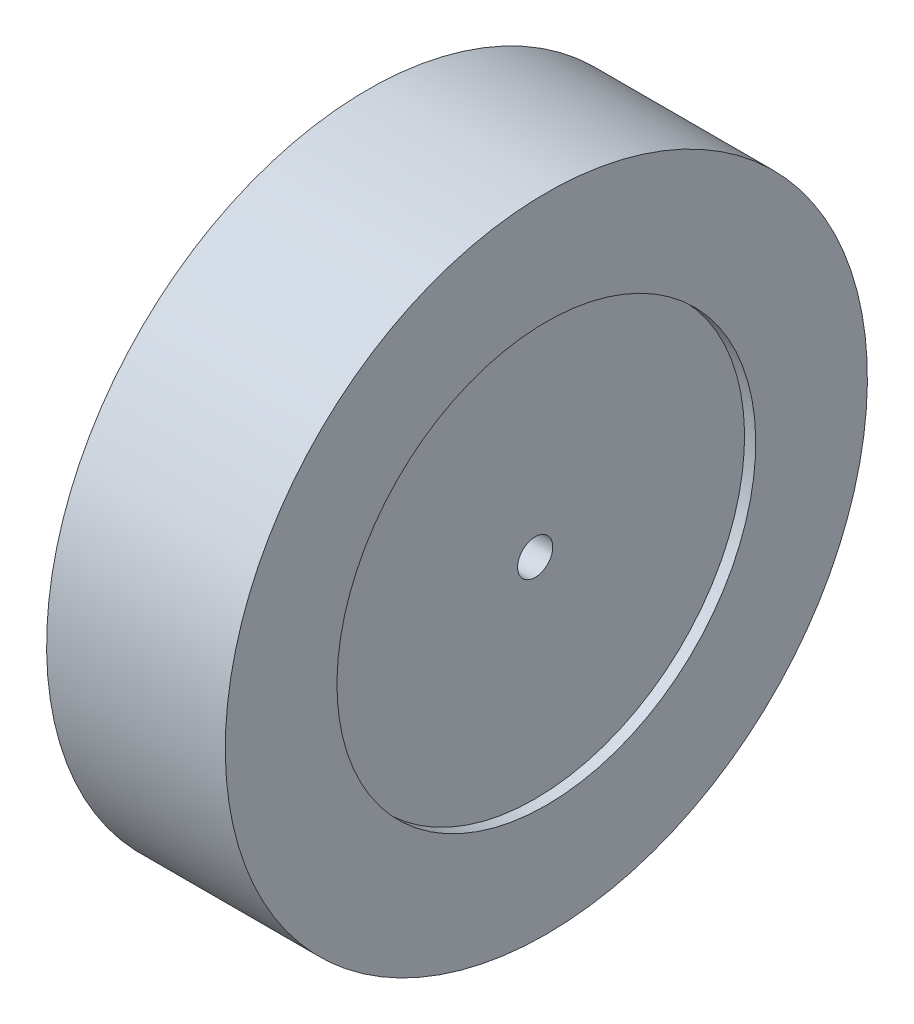
ISO-10303-21;
HEADER;
FILE_DESCRIPTION(('STEP AP214'),'2;1');
FILE_NAME('part.step','',(''),(''),'','','');
FILE_SCHEMA(('AUTOMOTIVE_DESIGN { 1 0 10303 214 1 1 1 1 }'));
ENDSEC;
DATA;
#1=APPLICATION_CONTEXT('core data for automotive mechanical design processes');
#2=APPLICATION_PROTOCOL_DEFINITION('international standard','automotive_design',2000,#1);
#3=PRODUCT_CONTEXT('',#1,'mechanical');
#4=PRODUCT('Part','Part','',(#3));
#5=PRODUCT_RELATED_PRODUCT_CATEGORY('part','',(#4));
#6=PRODUCT_DEFINITION_FORMATION('','',#4);
#7=PRODUCT_DEFINITION_CONTEXT('part definition',#1,'design');
#8=PRODUCT_DEFINITION('design','',#6,#7);
#9=PRODUCT_DEFINITION_SHAPE('','',#8);
#10=(LENGTH_UNIT() NAMED_UNIT(*) SI_UNIT(.MILLI.,.METRE.));
#11=(NAMED_UNIT(*) PLANE_ANGLE_UNIT() SI_UNIT($,.RADIAN.));
#12=(NAMED_UNIT(*) SI_UNIT($,.STERADIAN.) SOLID_ANGLE_UNIT());
#13=UNCERTAINTY_MEASURE_WITH_UNIT(LENGTH_MEASURE(1.E-05),#10,'distance_accuracy_value','');
#14=(GEOMETRIC_REPRESENTATION_CONTEXT(3) GLOBAL_UNCERTAINTY_ASSIGNED_CONTEXT((#13)) GLOBAL_UNIT_ASSIGNED_CONTEXT((#10,
#11,#12)) REPRESENTATION_CONTEXT('',''));
#15=CARTESIAN_POINT('',(0.,0.,0.));
#16=DIRECTION('',(0.,0.,1.));
#17=DIRECTION('',(1.,0.,0.));
#18=AXIS2_PLACEMENT_3D('',#15,#16,#17);
#19=CARTESIAN_POINT('',(-8.89,0.,0.));
#20=DIRECTION('',(-1.,0.,0.));
#21=DIRECTION('',(0.,-1.,0.));
#22=AXIS2_PLACEMENT_3D('',#19,#20,#21);
#23=CYLINDRICAL_SURFACE('',#22,36.5125);
#24=CARTESIAN_POINT('',(-10.16,0.,0.));
#25=DIRECTION('',(-1.,0.,0.));
#26=DIRECTION('',(0.,-1.,0.));
#27=AXIS2_PLACEMENT_3D('',#24,#25,#26);
#28=CIRCLE('',#27,36.5125);
#29=CARTESIAN_POINT('',(-10.16,-36.5125,0.));
#30=VERTEX_POINT('',#29);
#31=EDGE_CURVE('E12',#30,#30,#28,.T.);
#32=ORIENTED_EDGE('',*,*,#31,.F.);
#33=EDGE_LOOP('',(#32));
#34=FACE_BOUND('',#33,.T.);
#35=CARTESIAN_POINT('',(10.16,0.,0.));
#36=DIRECTION('',(-1.,0.,0.));
#37=DIRECTION('',(0.,-1.,0.));
#38=AXIS2_PLACEMENT_3D('',#35,#36,#37);
#39=CIRCLE('',#38,36.5125);
#40=CARTESIAN_POINT('',(10.16,-36.5125,0.));
#41=VERTEX_POINT('',#40);
#42=EDGE_CURVE('E73',#41,#41,#39,.T.);
#43=ORIENTED_EDGE('',*,*,#42,.T.);
#44=EDGE_LOOP('',(#43));
#45=FACE_BOUND('',#44,.T.);
#46=ADVANCED_FACE('F45',(#34,#45),#23,.T.);
#47=CARTESIAN_POINT('',(-10.16,0.,0.));
#48=DIRECTION('',(-1.,0.,0.));
#49=DIRECTION('',(0.,-1.,0.));
#50=AXIS2_PLACEMENT_3D('',#47,#48,#49);
#51=PLANE('',#50);
#52=ORIENTED_EDGE('',*,*,#31,.T.);
#53=EDGE_LOOP('',(#52));
#54=FACE_BOUND('',#53,.T.);
#55=CARTESIAN_POINT('',(-10.16,0.,0.));
#56=DIRECTION('',(-1.,0.,0.));
#57=DIRECTION('',(0.,-1.,0.));
#58=AXIS2_PLACEMENT_3D('',#55,#56,#57);
#59=CIRCLE('',#58,23.8125);
#60=CARTESIAN_POINT('',(-10.16,-23.8125,0.));
#61=VERTEX_POINT('',#60);
#62=EDGE_CURVE('E51',#61,#61,#59,.T.);
#63=ORIENTED_EDGE('',*,*,#62,.F.);
#64=EDGE_LOOP('',(#63));
#65=FACE_BOUND('',#64,.T.);
#66=ADVANCED_FACE('F110',(#54,#65),#51,.T.);
#67=CARTESIAN_POINT('',(-8.89,0.,0.));
#68=DIRECTION('',(-1.,0.,0.));
#69=DIRECTION('',(0.,-1.,0.));
#70=AXIS2_PLACEMENT_3D('',#67,#68,#69);
#71=CYLINDRICAL_SURFACE('',#70,23.8125);
#72=ORIENTED_EDGE('',*,*,#62,.T.);
#73=EDGE_LOOP('',(#72));
#74=FACE_BOUND('',#73,.T.);
#75=CARTESIAN_POINT('',(-8.89,0.,0.));
#76=DIRECTION('',(-1.,0.,0.));
#77=DIRECTION('',(0.,-1.,0.));
#78=AXIS2_PLACEMENT_3D('',#75,#76,#77);
#79=CIRCLE('',#78,23.8125);
#80=CARTESIAN_POINT('',(-8.89,-23.8125,0.));
#81=VERTEX_POINT('',#80);
#82=EDGE_CURVE('E55',#81,#81,#79,.T.);
#83=ORIENTED_EDGE('',*,*,#82,.F.);
#84=EDGE_LOOP('',(#83));
#85=FACE_BOUND('',#84,.T.);
#86=ADVANCED_FACE('F104',(#74,#85),#71,.F.);
#87=CARTESIAN_POINT('',(-8.89,0.,0.));
#88=DIRECTION('',(-1.,0.,0.));
#89=DIRECTION('',(0.,-1.,0.));
#90=AXIS2_PLACEMENT_3D('',#87,#88,#89);
#91=PLANE('',#90);
#92=ORIENTED_EDGE('',*,*,#82,.T.);
#93=EDGE_LOOP('',(#92));
#94=FACE_BOUND('',#93,.T.);
#95=CARTESIAN_POINT('',(-8.89,0.,0.));
#96=DIRECTION('',(-1.,0.,0.));
#97=DIRECTION('',(0.,-1.,0.));
#98=AXIS2_PLACEMENT_3D('',#95,#96,#97);
#99=CIRCLE('',#98,2.);
#100=CARTESIAN_POINT('',(-8.89,-2.,0.));
#101=VERTEX_POINT('',#100);
#102=EDGE_CURVE('E59',#101,#101,#99,.T.);
#103=ORIENTED_EDGE('',*,*,#102,.F.);
#104=EDGE_LOOP('',(#103));
#105=FACE_BOUND('',#104,.T.);
#106=ADVANCED_FACE('F99',(#94,#105),#91,.T.);
#107=CARTESIAN_POINT('',(-8.89,0.,0.));
#108=DIRECTION('',(-1.,0.,0.));
#109=DIRECTION('',(0.,-1.,0.));
#110=AXIS2_PLACEMENT_3D('',#107,#108,#109);
#111=CYLINDRICAL_SURFACE('',#110,2.);
#112=CARTESIAN_POINT('',(8.89,0.,0.));
#113=DIRECTION('',(-1.,0.,0.));
#114=DIRECTION('',(0.,-1.,0.));
#115=AXIS2_PLACEMENT_3D('',#112,#113,#114);
#116=CIRCLE('',#115,2.);
#117=CARTESIAN_POINT('',(8.89,-2.,0.));
#118=VERTEX_POINT('',#117);
#119=EDGE_CURVE('E64',#118,#118,#116,.T.);
#120=ORIENTED_EDGE('',*,*,#119,.F.);
#121=EDGE_LOOP('',(#120));
#122=FACE_BOUND('',#121,.T.);
#123=ORIENTED_EDGE('',*,*,#102,.T.);
#124=EDGE_LOOP('',(#123));
#125=FACE_BOUND('',#124,.T.);
#126=ADVANCED_FACE('F93',(#122,#125),#111,.F.);
#127=CARTESIAN_POINT('',(8.89000000000001,0.,0.));
#128=DIRECTION('',(-1.,0.,0.));
#129=DIRECTION('',(0.,-1.,0.));
#130=AXIS2_PLACEMENT_3D('',#127,#128,#129);
#131=PLANE('',#130);
#132=CARTESIAN_POINT('',(8.89000000000001,0.,0.));
#133=DIRECTION('',(-1.,0.,0.));
#134=DIRECTION('',(0.,-1.,0.));
#135=AXIS2_PLACEMENT_3D('',#132,#133,#134);
#136=CIRCLE('',#135,23.8125);
#137=CARTESIAN_POINT('',(8.89000000000001,-23.8125,0.));
#138=VERTEX_POINT('',#137);
#139=EDGE_CURVE('E67',#138,#138,#136,.T.);
#140=ORIENTED_EDGE('',*,*,#139,.F.);
#141=EDGE_LOOP('',(#140));
#142=FACE_BOUND('',#141,.T.);
#143=ORIENTED_EDGE('',*,*,#119,.T.);
#144=EDGE_LOOP('',(#143));
#145=FACE_BOUND('',#144,.T.);
#146=ADVANCED_FACE('F87',(#142,#145),#131,.F.);
#147=CARTESIAN_POINT('',(-8.89,0.,0.));
#148=DIRECTION('',(-1.,0.,0.));
#149=DIRECTION('',(0.,-1.,0.));
#150=AXIS2_PLACEMENT_3D('',#147,#148,#149);
#151=CYLINDRICAL_SURFACE('',#150,23.8125);
#152=CARTESIAN_POINT('',(10.16,0.,0.));
#153=DIRECTION('',(-1.,0.,0.));
#154=DIRECTION('',(0.,-1.,0.));
#155=AXIS2_PLACEMENT_3D('',#152,#153,#154);
#156=CIRCLE('',#155,23.8125);
#157=CARTESIAN_POINT('',(10.16,-23.8125,0.));
#158=VERTEX_POINT('',#157);
#159=EDGE_CURVE('E70',#158,#158,#156,.T.);
#160=ORIENTED_EDGE('',*,*,#159,.F.);
#161=EDGE_LOOP('',(#160));
#162=FACE_BOUND('',#161,.T.);
#163=ORIENTED_EDGE('',*,*,#139,.T.);
#164=EDGE_LOOP('',(#163));
#165=FACE_BOUND('',#164,.T.);
#166=ADVANCED_FACE('F81',(#162,#165),#151,.F.);
#167=CARTESIAN_POINT('',(10.16,0.,0.));
#168=DIRECTION('',(-1.,0.,0.));
#169=DIRECTION('',(0.,-1.,0.));
#170=AXIS2_PLACEMENT_3D('',#167,#168,#169);
#171=PLANE('',#170);
#172=ORIENTED_EDGE('',*,*,#42,.F.);
#173=EDGE_LOOP('',(#172));
#174=FACE_BOUND('',#173,.T.);
#175=ORIENTED_EDGE('',*,*,#159,.T.);
#176=EDGE_LOOP('',(#175));
#177=FACE_BOUND('',#176,.T.);
#178=ADVANCED_FACE('F78',(#174,#177),#171,.F.);
#179=CLOSED_SHELL('',(#46,#66,#86,#106,#126,#146,#166,#178));
#180=MANIFOLD_SOLID_BREP('B2',#179);
#181=ADVANCED_BREP_SHAPE_REPRESENTATION('',(#18,#180),#14);
#182=SHAPE_DEFINITION_REPRESENTATION(#9,#181);
ENDSEC;
END-ISO-10303-21;
